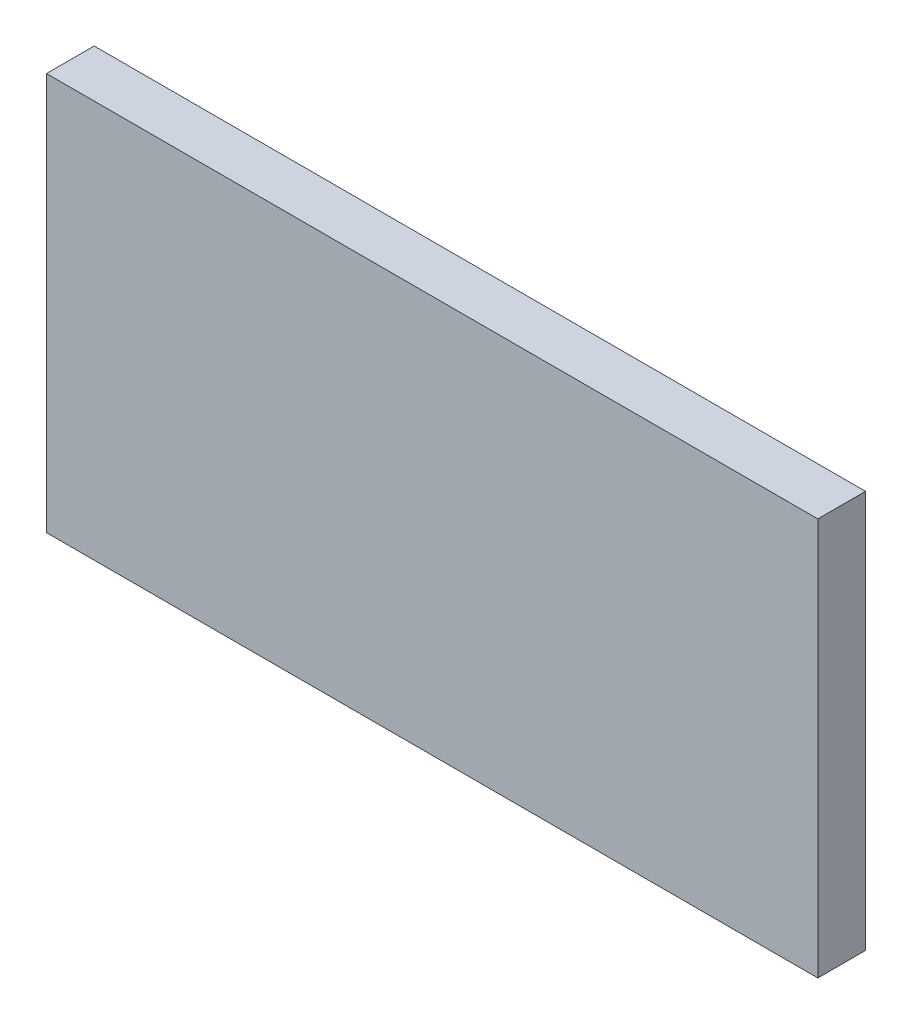
ISO-10303-21;
HEADER;
FILE_DESCRIPTION(('STEP AP214'),'2;1');
FILE_NAME('part.step','',(''),(''),'','','');
FILE_SCHEMA(('AUTOMOTIVE_DESIGN { 1 0 10303 214 1 1 1 1 }'));
ENDSEC;
DATA;
#1=APPLICATION_CONTEXT('core data for automotive mechanical design processes');
#2=APPLICATION_PROTOCOL_DEFINITION('international standard','automotive_design',2000,#1);
#3=PRODUCT_CONTEXT('',#1,'mechanical');
#4=PRODUCT('Part','Part','',(#3));
#5=PRODUCT_RELATED_PRODUCT_CATEGORY('part','',(#4));
#6=PRODUCT_DEFINITION_FORMATION('','',#4);
#7=PRODUCT_DEFINITION_CONTEXT('part definition',#1,'design');
#8=PRODUCT_DEFINITION('design','',#6,#7);
#9=PRODUCT_DEFINITION_SHAPE('','',#8);
#10=(LENGTH_UNIT() NAMED_UNIT(*) SI_UNIT(.MILLI.,.METRE.));
#11=(NAMED_UNIT(*) PLANE_ANGLE_UNIT() SI_UNIT($,.RADIAN.));
#12=(NAMED_UNIT(*) SI_UNIT($,.STERADIAN.) SOLID_ANGLE_UNIT());
#13=UNCERTAINTY_MEASURE_WITH_UNIT(LENGTH_MEASURE(1.E-05),#10,'distance_accuracy_value','');
#14=(GEOMETRIC_REPRESENTATION_CONTEXT(3) GLOBAL_UNCERTAINTY_ASSIGNED_CONTEXT((#13)) GLOBAL_UNIT_ASSIGNED_CONTEXT((#10,
#11,#12)) REPRESENTATION_CONTEXT('',''));
#15=CARTESIAN_POINT('',(0.,0.,0.));
#16=DIRECTION('',(0.,0.,1.));
#17=DIRECTION('',(1.,0.,0.));
#18=AXIS2_PLACEMENT_3D('',#15,#16,#17);
#19=CARTESIAN_POINT('',(-48.5,25.,6.));
#20=DIRECTION('',(1.,0.,0.));
#21=DIRECTION('',(0.,1.,0.));
#22=AXIS2_PLACEMENT_3D('',#19,#20,#21);
#23=PLANE('',#22);
#24=DIRECTION('',(0.,-1.,0.));
#25=VECTOR('',#24,1.);
#26=CARTESIAN_POINT('',(-48.5,25.,0.));
#27=LINE('',#26,#25);
#28=CARTESIAN_POINT('',(-48.5,25.,0.));
#29=VERTEX_POINT('',#28);
#30=CARTESIAN_POINT('',(-48.5,-25.,0.));
#31=VERTEX_POINT('',#30);
#32=EDGE_CURVE('E104',#29,#31,#27,.T.);
#33=ORIENTED_EDGE('',*,*,#32,.T.);
#34=DIRECTION('',(0.,0.,-1.));
#35=VECTOR('',#34,1.);
#36=CARTESIAN_POINT('',(-48.5,-25.,6.));
#37=LINE('',#36,#35);
#38=CARTESIAN_POINT('',(-48.5,-25.,6.));
#39=VERTEX_POINT('',#38);
#40=EDGE_CURVE('E11',#39,#31,#37,.T.);
#41=ORIENTED_EDGE('',*,*,#40,.F.);
#42=DIRECTION('',(0.,-1.,0.));
#43=VECTOR('',#42,1.);
#44=CARTESIAN_POINT('',(-48.5,25.,6.));
#45=LINE('',#44,#43);
#46=CARTESIAN_POINT('',(-48.5,25.,6.));
#47=VERTEX_POINT('',#46);
#48=EDGE_CURVE('E92',#47,#39,#45,.T.);
#49=ORIENTED_EDGE('',*,*,#48,.F.);
#50=DIRECTION('',(0.,0.,-1.));
#51=VECTOR('',#50,1.);
#52=CARTESIAN_POINT('',(-48.5,25.,6.));
#53=LINE('',#52,#51);
#54=EDGE_CURVE('E100',#47,#29,#53,.T.);
#55=ORIENTED_EDGE('',*,*,#54,.T.);
#56=EDGE_LOOP('',(#33,#41,#49,#55));
#57=FACE_BOUND('',#56,.T.);
#58=ADVANCED_FACE('F41',(#57),#23,.F.);
#59=CARTESIAN_POINT('',(48.5,-25.,6.));
#60=DIRECTION('',(0.,1.,0.));
#61=DIRECTION('',(-1.,0.,0.));
#62=AXIS2_PLACEMENT_3D('',#59,#60,#61);
#63=PLANE('',#62);
#64=DIRECTION('',(1.,0.,0.));
#65=VECTOR('',#64,1.);
#66=CARTESIAN_POINT('',(48.5,-25.,0.));
#67=LINE('',#66,#65);
#68=CARTESIAN_POINT('',(48.5,-25.,0.));
#69=VERTEX_POINT('',#68);
#70=EDGE_CURVE('E96',#31,#69,#67,.T.);
#71=ORIENTED_EDGE('',*,*,#70,.T.);
#72=DIRECTION('',(0.,0.,-1.));
#73=VECTOR('',#72,1.);
#74=CARTESIAN_POINT('',(48.5,-25.,6.));
#75=LINE('',#74,#73);
#76=CARTESIAN_POINT('',(48.5,-25.,6.));
#77=VERTEX_POINT('',#76);
#78=EDGE_CURVE('E49',#77,#69,#75,.T.);
#79=ORIENTED_EDGE('',*,*,#78,.F.);
#80=DIRECTION('',(1.,0.,0.));
#81=VECTOR('',#80,1.);
#82=CARTESIAN_POINT('',(48.5,-25.,6.));
#83=LINE('',#82,#81);
#84=EDGE_CURVE('E87',#39,#77,#83,.T.);
#85=ORIENTED_EDGE('',*,*,#84,.F.);
#86=ORIENTED_EDGE('',*,*,#40,.T.);
#87=EDGE_LOOP('',(#71,#79,#85,#86));
#88=FACE_BOUND('',#87,.T.);
#89=ADVANCED_FACE('F95',(#88),#63,.F.);
#90=CARTESIAN_POINT('',(48.5,25.,6.));
#91=DIRECTION('',(-1.,0.,0.));
#92=DIRECTION('',(0.,0.,1.));
#93=AXIS2_PLACEMENT_3D('',#90,#91,#92);
#94=PLANE('',#93);
#95=DIRECTION('',(0.,1.,0.));
#96=VECTOR('',#95,1.);
#97=CARTESIAN_POINT('',(48.5,25.,0.));
#98=LINE('',#97,#96);
#99=CARTESIAN_POINT('',(48.5,25.,0.));
#100=VERTEX_POINT('',#99);
#101=EDGE_CURVE('E74',#69,#100,#98,.T.);
#102=ORIENTED_EDGE('',*,*,#101,.T.);
#103=DIRECTION('',(0.,0.,-1.));
#104=VECTOR('',#103,1.);
#105=CARTESIAN_POINT('',(48.5,25.,6.));
#106=LINE('',#105,#104);
#107=CARTESIAN_POINT('',(48.5,25.,6.));
#108=VERTEX_POINT('',#107);
#109=EDGE_CURVE('E97',#108,#100,#106,.T.);
#110=ORIENTED_EDGE('',*,*,#109,.F.);
#111=DIRECTION('',(0.,1.,0.));
#112=VECTOR('',#111,1.);
#113=CARTESIAN_POINT('',(48.5,25.,6.));
#114=LINE('',#113,#112);
#115=EDGE_CURVE('E90',#77,#108,#114,.T.);
#116=ORIENTED_EDGE('',*,*,#115,.F.);
#117=ORIENTED_EDGE('',*,*,#78,.T.);
#118=EDGE_LOOP('',(#102,#110,#116,#117));
#119=FACE_BOUND('',#118,.T.);
#120=ADVANCED_FACE('F98',(#119),#94,.F.);
#121=CARTESIAN_POINT('',(48.5,25.,6.));
#122=DIRECTION('',(0.,-1.,0.));
#123=DIRECTION('',(1.,0.,0.));
#124=AXIS2_PLACEMENT_3D('',#121,#122,#123);
#125=PLANE('',#124);
#126=DIRECTION('',(-1.,0.,0.));
#127=VECTOR('',#126,1.);
#128=CARTESIAN_POINT('',(48.5,25.,0.));
#129=LINE('',#128,#127);
#130=EDGE_CURVE('E80',#100,#29,#129,.T.);
#131=ORIENTED_EDGE('',*,*,#130,.T.);
#132=ORIENTED_EDGE('',*,*,#54,.F.);
#133=DIRECTION('',(-1.,0.,0.));
#134=VECTOR('',#133,1.);
#135=CARTESIAN_POINT('',(48.5,25.,6.));
#136=LINE('',#135,#134);
#137=EDGE_CURVE('E57',#108,#47,#136,.T.);
#138=ORIENTED_EDGE('',*,*,#137,.F.);
#139=ORIENTED_EDGE('',*,*,#109,.T.);
#140=EDGE_LOOP('',(#131,#132,#138,#139));
#141=FACE_BOUND('',#140,.T.);
#142=ADVANCED_FACE('F111',(#141),#125,.F.);
#143=CARTESIAN_POINT('',(0.,0.,6.));
#144=DIRECTION('',(0.,0.,-1.));
#145=DIRECTION('',(-1.,0.,0.));
#146=AXIS2_PLACEMENT_3D('',#143,#144,#145);
#147=PLANE('',#146);
#148=ORIENTED_EDGE('',*,*,#48,.T.);
#149=ORIENTED_EDGE('',*,*,#84,.T.);
#150=ORIENTED_EDGE('',*,*,#115,.T.);
#151=ORIENTED_EDGE('',*,*,#137,.T.);
#152=EDGE_LOOP('',(#148,#149,#150,#151));
#153=FACE_BOUND('',#152,.T.);
#154=ADVANCED_FACE('F88',(#153),#147,.F.);
#155=CARTESIAN_POINT('',(0.,0.,0.));
#156=DIRECTION('',(0.,0.,-1.));
#157=DIRECTION('',(-1.,0.,0.));
#158=AXIS2_PLACEMENT_3D('',#155,#156,#157);
#159=PLANE('',#158);
#160=ORIENTED_EDGE('',*,*,#32,.F.);
#161=ORIENTED_EDGE('',*,*,#130,.F.);
#162=ORIENTED_EDGE('',*,*,#101,.F.);
#163=ORIENTED_EDGE('',*,*,#70,.F.);
#164=EDGE_LOOP('',(#160,#161,#162,#163));
#165=FACE_BOUND('',#164,.T.);
#166=ADVANCED_FACE('F114',(#165),#159,.T.);
#167=CLOSED_SHELL('',(#58,#89,#120,#142,#154,#166));
#168=MANIFOLD_SOLID_BREP('B2',#167);
#169=ADVANCED_BREP_SHAPE_REPRESENTATION('',(#18,#168),#14);
#170=SHAPE_DEFINITION_REPRESENTATION(#9,#169);
ENDSEC;
END-ISO-10303-21;
